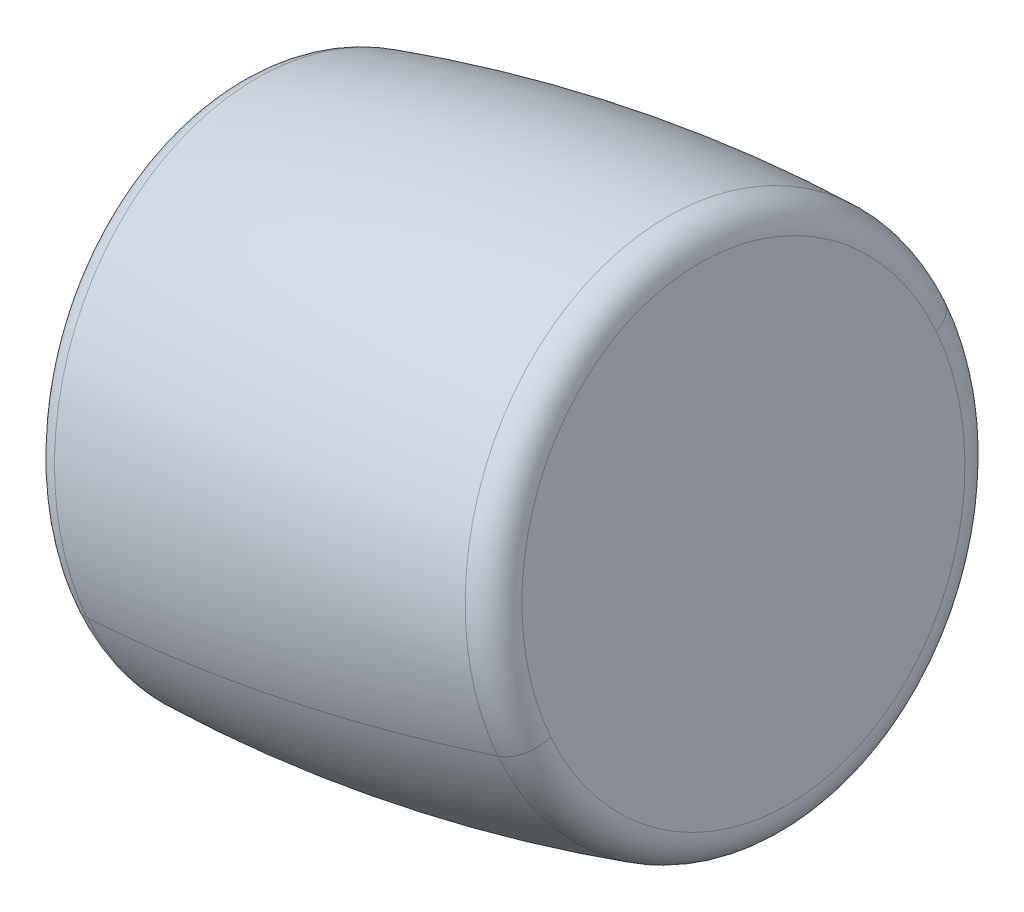
ISO-10303-21;
HEADER;
FILE_DESCRIPTION(('STEP AP214'),'2;1');
FILE_NAME('part.step','',(''),(''),'','','');
FILE_SCHEMA(('AUTOMOTIVE_DESIGN { 1 0 10303 214 1 1 1 1 }'));
ENDSEC;
DATA;
#1=APPLICATION_CONTEXT('core data for automotive mechanical design processes');
#2=APPLICATION_PROTOCOL_DEFINITION('international standard','automotive_design',2000,#1);
#3=PRODUCT_CONTEXT('',#1,'mechanical');
#4=PRODUCT('Part','Part','',(#3));
#5=PRODUCT_RELATED_PRODUCT_CATEGORY('part','',(#4));
#6=PRODUCT_DEFINITION_FORMATION('','',#4);
#7=PRODUCT_DEFINITION_CONTEXT('part definition',#1,'design');
#8=PRODUCT_DEFINITION('design','',#6,#7);
#9=PRODUCT_DEFINITION_SHAPE('','',#8);
#10=(LENGTH_UNIT() NAMED_UNIT(*) SI_UNIT(.MILLI.,.METRE.));
#11=(NAMED_UNIT(*) PLANE_ANGLE_UNIT() SI_UNIT($,.RADIAN.));
#12=(NAMED_UNIT(*) SI_UNIT($,.STERADIAN.) SOLID_ANGLE_UNIT());
#13=UNCERTAINTY_MEASURE_WITH_UNIT(LENGTH_MEASURE(1.E-05),#10,'distance_accuracy_value','');
#14=(GEOMETRIC_REPRESENTATION_CONTEXT(3) GLOBAL_UNCERTAINTY_ASSIGNED_CONTEXT((#13)) GLOBAL_UNIT_ASSIGNED_CONTEXT((#10,
#11,#12)) REPRESENTATION_CONTEXT('',''));
#15=CARTESIAN_POINT('',(0.,0.,0.));
#16=DIRECTION('',(0.,0.,1.));
#17=DIRECTION('',(1.,0.,0.));
#18=AXIS2_PLACEMENT_3D('',#15,#16,#17);
#19=CARTESIAN_POINT('',(1.54010446831639,26.713840470097,0.));
#20=DIRECTION('',(0.979045472484573,0.203641751140231,0.));
#21=DIRECTION('',(-0.203641751140231,0.979045472484573,0.));
#22=AXIS2_PLACEMENT_3D('',#19,#20,#21);
#23=PLANE('',#22);
#24=CARTESIAN_POINT('',(1.78853667863484,25.519456561249,3.75461180980708));
#25=CARTESIAN_POINT('',(1.80104744577193,25.4593087288212,3.73465175134516));
#26=CARTESIAN_POINT('',(1.81345825175028,25.3996414781963,3.71318133474125));
#27=CARTESIAN_POINT('',(1.83805047849984,25.2814097888562,3.66727713971395));
#28=CARTESIAN_POINT('',(1.85023189927106,25.2228453501411,3.64284336129057));
#29=CARTESIAN_POINT('',(1.87433589271673,25.1069609329248,3.59106979708889));
#30=CARTESIAN_POINT('',(1.88625846539118,25.0496409544237,3.56373001131059));
#31=CARTESIAN_POINT('',(1.90981607141257,24.9363833960465,3.50621070057865));
#32=CARTESIAN_POINT('',(1.9214511047595,24.8804458161703,3.47603117562501));
#33=CARTESIAN_POINT('',(1.94440559392697,24.7700878538822,3.41290498334538));
#34=CARTESIAN_POINT('',(1.95572504974751,24.7156674714703,3.3799583160194));
#35=CARTESIAN_POINT('',(1.97802111654827,24.6084749967775,3.31137723942565));
#36=CARTESIAN_POINT('',(1.98899772752849,24.5557029044967,3.27574283015788));
#37=CARTESIAN_POINT('',(2.01058166042933,24.4519341455528,3.20187210831697));
#38=CARTESIAN_POINT('',(2.02118898234995,24.4009374788898,3.16363579574382));
#39=CARTESIAN_POINT('',(2.04200878332531,24.3008424258428,3.084653384002));
#40=CARTESIAN_POINT('',(2.05222126238004,24.2517440394589,3.04390728483333));
#41=CARTESIAN_POINT('',(2.07222677482385,24.1555638294913,2.96000346026396));
#42=CARTESIAN_POINT('',(2.08201980821292,24.1084820059076,2.91684573486326));
#43=CARTESIAN_POINT('',(2.10116283706178,24.0164483457216,2.82822262872009));
#44=CARTESIAN_POINT('',(2.11051283252157,23.9714965091193,2.78275724797762));
#45=CARTESIAN_POINT('',(2.12874726055074,23.8838311158228,2.68962836119535));
#46=CARTESIAN_POINT('',(2.13763169312012,23.8411175591285,2.64196485515554));
#47=CARTESIAN_POINT('',(2.15491359199305,23.7580316263434,2.54455454335019));
#48=CARTESIAN_POINT('',(2.1633110582966,23.7176592502525,2.49480773758466));
#49=CARTESIAN_POINT('',(2.17959879440581,23.6393529392655,2.39335067073738));
#50=CARTESIAN_POINT('',(2.18748906421146,23.6014190043693,2.34164040965564));
#51=CARTESIAN_POINT('',(2.20274339897384,23.528080961943,2.23638100672495));
#52=CARTESIAN_POINT('',(2.21010746393058,23.4926768544129,2.18283186487601));
#53=CARTESIAN_POINT('',(2.22429164831764,23.4244837583151,2.07402370498377));
#54=CARTESIAN_POINT('',(2.23111176774795,23.3916947697474,2.01876468694047));
#55=CARTESIAN_POINT('',(2.24419163081708,23.3288109031196,1.90666989847417));
#56=CARTESIAN_POINT('',(2.2504513744559,23.2987160250596,1.84983412805117));
#57=CARTESIAN_POINT('',(2.26239540567131,23.2412928806445,1.73472275717462));
#58=CARTESIAN_POINT('',(2.26807969324791,23.2139646142894,1.67644715672107));
#59=CARTESIAN_POINT('',(2.27885911839224,23.1621405294716,1.55859651680926));
#60=CARTESIAN_POINT('',(2.28395425595997,23.1376447110089,1.499021477351));
#61=CARTESIAN_POINT('',(2.29354310645387,23.0915445345479,1.37871548091797));
#62=CARTESIAN_POINT('',(2.29803681938004,23.0699401765497,1.31798452394321));
#63=CARTESIAN_POINT('',(2.30641199484279,23.0296749678086,1.19551299867194));
#64=CARTESIAN_POINT('',(2.31029345737937,23.0110141170656,1.13377243037544));
#65=CARTESIAN_POINT('',(2.31743478127971,22.976680878459,1.00943042089754));
#66=CARTESIAN_POINT('',(2.32069464264346,22.9610084905953,0.946828979716151));
#67=CARTESIAN_POINT('',(2.3265849109066,22.9326899339022,0.820916036823533));
#68=CARTESIAN_POINT('',(2.32921531780597,22.9200437650729,0.757604535112306));
#69=CARTESIAN_POINT('',(2.33384034025973,22.8978081121768,0.630423994113066));
#70=CARTESIAN_POINT('',(2.33583495581412,22.8882186281102,0.566554954825055));
#71=CARTESIAN_POINT('',(2.33918359037431,22.8721194466466,0.43841320478216));
#72=CARTESIAN_POINT('',(2.34053760938012,22.8656097492497,0.374140494027277));
#73=CARTESIAN_POINT('',(2.34260178889279,22.8556858235569,0.245346239640472));
#74=CARTESIAN_POINT('',(2.34331194939964,22.852271595261,0.18082469600855));
#75=CARTESIAN_POINT('',(2.34408670107553,22.8485468329452,0.0516882139176979));
#76=CARTESIAN_POINT('',(2.34415129224456,22.8482362989252,-0.0129267245412326));
#77=CARTESIAN_POINT('',(2.34363474963903,22.850719673265,-0.142094333239756));
#78=CARTESIAN_POINT('',(2.34305361586446,22.8535135816248,-0.206647003479349));
#79=CARTESIAN_POINT('',(2.34124702337388,22.8621991099539,-0.335534562702444));
#80=CARTESIAN_POINT('',(2.34002156465787,22.8680907299233,-0.399869451685945));
#81=CARTESIAN_POINT('',(2.3369292745218,22.8829574880433,-0.528166460014223));
#82=CARTESIAN_POINT('',(2.33506244310174,22.8919326261939,-0.592128579359001));
#83=CARTESIAN_POINT('',(2.33069190491796,22.9129447987822,-0.719525958061912));
#84=CARTESIAN_POINT('',(2.32818819815425,22.9249818332199,-0.782961217420044));
#85=CARTESIAN_POINT('',(2.32254994093207,22.9520888001124,-0.909152055053596));
#86=CARTESIAN_POINT('',(2.3194153904736,22.9671587325671,-0.971907633329017));
#87=CARTESIAN_POINT('',(2.31252299726851,23.0002951907061,-1.09658792511234));
#88=CARTESIAN_POINT('',(2.3087651545219,23.0183617163905,-1.15851263862025));
#89=CARTESIAN_POINT('',(2.30063522971284,23.0574478371461,-1.28138201880974));
#90=CARTESIAN_POINT('',(2.2962631476504,23.0784674322173,-1.34232668549132));
#91=CARTESIAN_POINT('',(2.28691527693834,23.123409053701,-1.46308915098801));
#92=CARTESIAN_POINT('',(2.28193948828872,23.1473310801134,-1.52290694980311));
#93=CARTESIAN_POINT('',(2.27139619151297,23.1980199340226,-1.64127157325007));
#94=CARTESIAN_POINT('',(2.26582868338684,23.2247867615194,-1.69981839788193));
#95=CARTESIAN_POINT('',(2.25411536027282,23.2811007339652,-1.81550002853377));
#96=CARTESIAN_POINT('',(2.24796954528493,23.3106478789143,-1.87263483455375));
#97=CARTESIAN_POINT('',(2.23511441425399,23.3724513046046,-1.9853547852297));
#98=CARTESIAN_POINT('',(2.22840509821094,23.4047075853458,-2.04093992988568));
#99=CARTESIAN_POINT('',(2.21443912839971,23.4718515744147,-2.15042664835148));
#100=CARTESIAN_POINT('',(2.20718247463152,23.5067392827425,-2.2043282221613));
#101=CARTESIAN_POINT('',(2.19213931128455,23.5790620794393,-2.31031794532225));
#102=CARTESIAN_POINT('',(2.18435280170576,23.6164971678084,-2.36240609467338));
#103=CARTESIAN_POINT('',(2.16826868512117,23.6938245401811,-2.46464348400279));
#104=CARTESIAN_POINT('',(2.15997107811537,23.7337168241848,-2.51479272398106));
#105=CARTESIAN_POINT('',(2.14288475633882,23.8158624838203,-2.61303148065309));
#106=CARTESIAN_POINT('',(2.13409604156807,23.8581158594522,-2.66112099734684));
#107=CARTESIAN_POINT('',(2.11604867704531,23.9448819102613,-2.75512445559197));
#108=CARTESIAN_POINT('',(2.1067900272933,23.9893945854385,-2.80103839714334));
#109=CARTESIAN_POINT('',(2.08782509770622,24.080572000405,-2.89058009439693));
#110=CARTESIAN_POINT('',(2.07811881787115,24.1272367401943,-2.93420785009914));
#111=CARTESIAN_POINT('',(2.05828201139626,24.2226058649393,-3.01907207256957));
#112=CARTESIAN_POINT('',(2.04815148475644,24.2713102498951,-3.06030853933779));
#113=CARTESIAN_POINT('',(2.02749058999804,24.3706413318438,-3.14029084167991));
#114=CARTESIAN_POINT('',(2.01696022187946,24.4212680288368,-3.17903667725381));
#115=CARTESIAN_POINT('',(1.9955250127427,24.5243217707124,-3.25394437509565));
#116=CARTESIAN_POINT('',(1.98462017172451,24.5767488155951,-3.2901062373636));
#117=CARTESIAN_POINT('',(1.96246228750571,24.683276951907,-3.35975887149992));
#118=CARTESIAN_POINT('',(1.95120924430508,24.7373780433362,-3.3932496433683));
#119=CARTESIAN_POINT('',(1.92838206528811,24.8471239384733,-3.45747941450263));
#120=CARTESIAN_POINT('',(1.91680792947177,24.9027687421811,-3.48821841376857));
#121=CARTESIAN_POINT('',(1.89336644833032,25.0154680086693,-3.54687058675636));
#122=CARTESIAN_POINT('',(1.88149910300521,25.0725224714496,-3.57478376047822));
#123=CARTESIAN_POINT('',(1.85749979232057,25.1879036068847,-3.62771703709744));
#124=CARTESIAN_POINT('',(1.84536782696104,25.2462302795394,-3.65273713999481));
#125=CARTESIAN_POINT('',(1.82086850317475,25.3640153206599,-3.69982399934564));
#126=CARTESIAN_POINT('',(1.80850114474799,25.4234736891257,-3.7218907557991));
#127=CARTESIAN_POINT('',(1.78356082887693,25.5433788814508,-3.76301776151319));
#128=CARTESIAN_POINT('',(1.77098787143263,25.6038257053102,-3.78207801077383));
#129=CARTESIAN_POINT('',(1.74566664688227,25.725562186729,-3.81714608429153));
#130=CARTESIAN_POINT('',(1.73291837977622,25.7868518442886,-3.83315390854861));
#131=CARTESIAN_POINT('',(1.70727724759427,25.9101263409551,-3.8620785678114));
#132=CARTESIAN_POINT('',(1.69438438251838,25.9721111800622,-3.87499540281712));
#133=CARTESIAN_POINT('',(1.66848511443861,26.0966267129143,-3.89770696577921));
#134=CARTESIAN_POINT('',(1.65547871143474,26.1591574066593,-3.90750169373559));
#135=CARTESIAN_POINT('',(1.62938370106079,26.2846140068801,-3.92394544628281));
#136=CARTESIAN_POINT('',(1.61629509369071,26.3475399133558,-3.93059447087366));
#137=CARTESIAN_POINT('',(1.59006720619447,26.4736353449766,-3.94073079845274));
#138=CARTESIAN_POINT('',(1.57692792606831,26.5368048701216,-3.94421810144098));
#139=CARTESIAN_POINT('',(1.55063034670472,26.663235358315,-3.94802258517295));
#140=CARTESIAN_POINT('',(1.5374720474673,26.7264963213634,-3.94833976591668));
#141=CARTESIAN_POINT('',(1.51116812949551,26.8529572835909,-3.94580323889208));
#142=CARTESIAN_POINT('',(1.49802251076114,26.91615728277,-3.94294953112374));
#143=CARTESIAN_POINT('',(1.47177562229858,27.042344065059,-3.93407810993601));
#144=CARTESIAN_POINT('',(1.45867435257038,27.1053308481689,-3.92806039651661));
#145=CARTESIAN_POINT('',(1.43254772588292,27.2309394496783,-3.91287543126068));
#146=CARTESIAN_POINT('',(1.41952236892366,27.2935612680778,-3.90370817942416));
#147=CARTESIAN_POINT('',(1.39357894081786,27.418289108442,-3.88224633387669));
#148=CARTESIAN_POINT('',(1.38066086967131,27.4803951304068,-3.86995174016575));
#149=CARTESIAN_POINT('',(1.35496315702747,27.6039416481336,-3.84226441226705));
#150=CARTESIAN_POINT('',(1.34218351553016,27.6653821438957,-3.82687167807929));
#151=CARTESIAN_POINT('',(1.31679336335599,27.7874500076448,-3.79302670926388));
#152=CARTESIAN_POINT('',(1.30418285267913,27.8480773756318,-3.77457447463623));
#153=CARTESIAN_POINT('',(1.2916722579981,27.9082243789451,-3.75461180980708));
#154=B_SPLINE_CURVE_WITH_KNOTS('',3,(#24,#25,#26,#27,#28,#29,#30,#31,#32,#33,#34,#35,#36,#37,
#38,#39,#40,#41,#42,#43,#44,#45,#46,#47,#48,#49,#50,#51,#52,#53,#54,#55,#56,#57,#58,#59,#60,#61,
#62,#63,#64,#65,#66,#67,#68,#69,#70,#71,#72,#73,#74,#75,#76,#77,#78,#79,#80,#81,#82,#83,#84,#85,
#86,#87,#88,#89,#90,#91,#92,#93,#94,#95,#96,#97,#98,#99,#100,#101,#102,#103,#104,#105,#106,#107,
#108,#109,#110,#111,#112,#113,#114,#115,#116,#117,#118,#119,#120,#121,#122,#123,#124,#125,#126,
#127,#128,#129,#130,#131,#132,#133,#134,#135,#136,#137,#138,#139,#140,#141,#142,#143,#144,#145,
#146,#147,#148,#149,#150,#151,#152,#153),.UNSPECIFIED.,.F.,.F.,(4,2,2,2,2,2,2,2,2,2,2,2,2,2,2,2,
2,2,2,2,2,2,2,2,2,2,2,2,2,2,2,2,2,2,2,2,2,2,2,2,2,2,2,2,2,2,2,2,2,2,2,2,2,2,2,2,2,2,2,2,2,2,2,2,
4),(0.,0.193769318353957,0.387538636707915,0.581307955061874,0.775077273415829,
0.968846591769789,1.16261591012375,1.3563852284777,1.55015454683166,1.74392386518562,
1.93769318353958,2.13146250189353,2.32523182024749,2.51900113860145,2.71277045695541,
2.90653977530936,3.10030909366332,3.29407841201728,3.48784773037124,3.6816170487252,
3.87538636707915,4.06915568543311,4.26292500378707,4.45669432214103,4.65046364049498,
4.84423295884894,5.0380022772029,5.23177159555686,5.42554091391081,5.61931023226477,
5.81307955061873,6.00684886897268,6.20061818732664,6.3943875056806,6.58815682403456,
6.78192614238851,6.97569546074247,7.16946477909643,7.36323409745039,7.55700341580435,
7.7507727341583,7.94454205251226,8.13831137086622,8.33208068922018,8.52585000757413,
8.71961932592809,8.91338864428205,9.10715796263601,9.30092728098997,9.49469659934392,
9.68846591769788,9.88223523605184,10.0760045544058,10.2697738727598,10.4635431911137,
10.6573125094677,10.8510818278216,11.0448511461756,11.2386204645295,11.4323897828835,
11.6261591012375,11.8199284195914,12.0136977379454,12.2074670562993,12.4012363746533),.UNSPECIFIED.);
#155=CARTESIAN_POINT('',(1.78853667863483,25.519456561249,3.75461180980708));
#156=VERTEX_POINT('',#155);
#157=CARTESIAN_POINT('',(1.2916722579981,27.9082243789451,-3.75461180980708));
#158=VERTEX_POINT('',#157);
#159=EDGE_CURVE('E11',#156,#158,#154,.T.);
#160=ORIENTED_EDGE('',*,*,#159,.F.);
#161=CARTESIAN_POINT('',(1.2916722579981,27.9082243789451,-3.75461180980708));
#162=CARTESIAN_POINT('',(1.279161490861,27.9683722113729,-3.73465175134517));
#163=CARTESIAN_POINT('',(1.26675068488266,28.0280394619978,-3.71318133474125));
#164=CARTESIAN_POINT('',(1.24215845813309,28.1462711513379,-3.66727713971395));
#165=CARTESIAN_POINT('',(1.22997703736187,28.204835590053,-3.64284336129057));
#166=CARTESIAN_POINT('',(1.2058730439162,28.3207200072692,-3.59106979708889));
#167=CARTESIAN_POINT('',(1.19395047124175,28.3780399857703,-3.56373001131059));
#168=CARTESIAN_POINT('',(1.17039286522037,28.4912975441476,-3.50621070057865));
#169=CARTESIAN_POINT('',(1.15875783187344,28.5472351240237,-3.47603117562501));
#170=CARTESIAN_POINT('',(1.13580334270596,28.6575930863118,-3.41290498334538));
#171=CARTESIAN_POINT('',(1.12448388688542,28.7120134687238,-3.3799583160194));
#172=CARTESIAN_POINT('',(1.10218782008466,28.8192059434166,-3.31137723942565));
#173=CARTESIAN_POINT('',(1.09121120910444,28.8719780356974,-3.27574283015789));
#174=CARTESIAN_POINT('',(1.0696272762036,28.9757467946413,-3.20187210831697));
#175=CARTESIAN_POINT('',(1.05901995428298,29.0267434613043,-3.16363579574382));
#176=CARTESIAN_POINT('',(1.03820015330762,29.1268385143512,-3.084653384002));
#177=CARTESIAN_POINT('',(1.02798767425289,29.1759369007352,-3.04390728483333));
#178=CARTESIAN_POINT('',(1.00798216180908,29.2721171107028,-2.96000346026396));
#179=CARTESIAN_POINT('',(0.998189128420011,29.3191989342865,-2.91684573486326));
#180=CARTESIAN_POINT('',(0.979046099571149,29.4112325944725,-2.82822262872009));
#181=CARTESIAN_POINT('',(0.96969610411136,29.4561844310748,-2.78275724797762));
#182=CARTESIAN_POINT('',(0.951461676082193,29.5438498243713,-2.68962836119535));
#183=CARTESIAN_POINT('',(0.942577243512815,29.5865633810655,-2.64196485515554));
#184=CARTESIAN_POINT('',(0.925295344639884,29.6696493138506,-2.54455454335019));
#185=CARTESIAN_POINT('',(0.916897878336331,29.7100216899415,-2.49480773758466));
#186=CARTESIAN_POINT('',(0.900610142227127,29.7883280009286,-2.39335067073738));
#187=CARTESIAN_POINT('',(0.892719872421477,29.8262619358248,-2.34164040965564));
#188=CARTESIAN_POINT('',(0.877465537659088,29.8995999782511,-2.23638100672496));
#189=CARTESIAN_POINT('',(0.870101472702349,29.9350040857811,-2.18283186487601));
#190=CARTESIAN_POINT('',(0.855917288315296,30.0031971818789,-2.07402370498377));
#191=CARTESIAN_POINT('',(0.849097168884982,30.0359861704467,-2.01876468694047));
#192=CARTESIAN_POINT('',(0.836017305815853,30.0988700370744,-1.90666989847418));
#193=CARTESIAN_POINT('',(0.829757562177038,30.1289649151345,-1.84983412805117));
#194=CARTESIAN_POINT('',(0.817813530961623,30.1863880595496,-1.73472275717462));
#195=CARTESIAN_POINT('',(0.812129243385023,30.2137163259046,-1.67644715672107));
#196=CARTESIAN_POINT('',(0.801349818240695,30.2655404107224,-1.55859651680926));
#197=CARTESIAN_POINT('',(0.796254680672968,30.2900362291852,-1.499021477351));
#198=CARTESIAN_POINT('',(0.786665830179066,30.3361364056462,-1.37871548091798));
#199=CARTESIAN_POINT('',(0.782172117252892,30.3577407636444,-1.31798452394321));
#200=CARTESIAN_POINT('',(0.773796941790139,30.3980059723855,-1.19551299867195));
#201=CARTESIAN_POINT('',(0.769915479253561,30.4166668231284,-1.13377243037544));
#202=CARTESIAN_POINT('',(0.762774155353227,30.4510000617351,-1.00943042089754));
#203=CARTESIAN_POINT('',(0.759514293989472,30.4666724495987,-0.946828979716154));
#204=CARTESIAN_POINT('',(0.753624025726338,30.4949910062918,-0.820916036823537));
#205=CARTESIAN_POINT('',(0.750993618826959,30.5076371751212,-0.757604535112309));
#206=CARTESIAN_POINT('',(0.746368596373198,30.5298728280172,-0.63042399411307));
#207=CARTESIAN_POINT('',(0.744373980818815,30.5394623120839,-0.566554954825058));
#208=CARTESIAN_POINT('',(0.741025346258622,30.5555614935474,-0.438413204782164));
#209=CARTESIAN_POINT('',(0.739671327252811,30.5620711909443,-0.374140494027281));
#210=CARTESIAN_POINT('',(0.737607147740147,30.5719951166371,-0.245346239640476));
#211=CARTESIAN_POINT('',(0.736896987233293,30.5754093449331,-0.180824696008554));
#212=CARTESIAN_POINT('',(0.736122235557404,30.5791341072489,-0.0516882139177011));
#213=CARTESIAN_POINT('',(0.73605764438837,30.5794446412688,0.0129267245412299));
#214=CARTESIAN_POINT('',(0.736574186993905,30.576961266929,0.142094333239753));
#215=CARTESIAN_POINT('',(0.737155320768474,30.5741673585693,0.206647003479346));
#216=CARTESIAN_POINT('',(0.738961913259052,30.5654818302401,0.33553456270244));
#217=CARTESIAN_POINT('',(0.74018737197506,30.5595902102707,0.399869451685941));
#218=CARTESIAN_POINT('',(0.743279662111132,30.5447234521508,0.528166460014219));
#219=CARTESIAN_POINT('',(0.745146493531196,30.5357483140002,0.592128579358995));
#220=CARTESIAN_POINT('',(0.749517031714971,30.5147361414119,0.719525958061905));
#221=CARTESIAN_POINT('',(0.752020738478684,30.5026991069741,0.782961217420039));
#222=CARTESIAN_POINT('',(0.757658995700865,30.4755921400817,0.909152055053593));
#223=CARTESIAN_POINT('',(0.760793546159333,30.460522207627,0.971907633329014));
#224=CARTESIAN_POINT('',(0.767685939364418,30.4273857494879,1.09658792511234));
#225=CARTESIAN_POINT('',(0.771443782111034,30.4093192238036,1.15851263862024));
#226=CARTESIAN_POINT('',(0.779573706920089,30.370233103048,1.28138201880973));
#227=CARTESIAN_POINT('',(0.783945788982528,30.3492135079767,1.34232668549131));
#228=CARTESIAN_POINT('',(0.793293659694592,30.3042718864931,1.463089150988));
#229=CARTESIAN_POINT('',(0.798269448344216,30.2803498600806,1.52290694980311));
#230=CARTESIAN_POINT('',(0.808812745119965,30.2296610061714,1.64127157325007));
#231=CARTESIAN_POINT('',(0.814380253246091,30.2028941786747,1.69981839788193));
#232=CARTESIAN_POINT('',(0.826093576360109,30.1465802062289,1.81550002853377));
#233=CARTESIAN_POINT('',(0.832239391348003,30.1170330612798,1.87263483455374));
#234=CARTESIAN_POINT('',(0.845094522378944,30.0552296355895,1.9853547852297));
#235=CARTESIAN_POINT('',(0.851803838421991,30.0229733548483,2.04093992988568));
#236=CARTESIAN_POINT('',(0.865769808233224,29.9558293657793,2.15042664835148));
#237=CARTESIAN_POINT('',(0.873026462001409,29.9209416574516,2.2043282221613));
#238=CARTESIAN_POINT('',(0.888069625348384,29.8486188607547,2.31031794532225));
#239=CARTESIAN_POINT('',(0.895856134927174,29.8111837723856,2.36240609467338));
#240=CARTESIAN_POINT('',(0.911940251511762,29.7338564000129,2.46464348400278));
#241=CARTESIAN_POINT('',(0.920237858517562,29.6939641160093,2.51479272398106));
#242=CARTESIAN_POINT('',(0.93732418029411,29.6118184563738,2.61303148065308));
#243=CARTESIAN_POINT('',(0.946112895064858,29.5695650807419,2.66112099734684));
#244=CARTESIAN_POINT('',(0.96416025958762,29.4827990299328,2.75512445559196));
#245=CARTESIAN_POINT('',(0.973418909339634,29.4382863547556,2.80103839714334));
#246=CARTESIAN_POINT('',(0.992383838926714,29.347108939789,2.89058009439692));
#247=CARTESIAN_POINT('',(1.00209011876178,29.3004441999998,2.93420785009913));
#248=CARTESIAN_POINT('',(1.02192692523667,29.2050750752547,3.01907207256957));
#249=CARTESIAN_POINT('',(1.03205745187649,29.1563706902989,3.06030853933779));
#250=CARTESIAN_POINT('',(1.05271834663489,29.0570396083502,3.14029084167991));
#251=CARTESIAN_POINT('',(1.06324871475347,29.0064129113573,3.1790366772538));
#252=CARTESIAN_POINT('',(1.08468392389023,28.9033591694816,3.25394437509565));
#253=CARTESIAN_POINT('',(1.09558876490842,28.850932124599,3.29010623736359));
#254=CARTESIAN_POINT('',(1.11774664912722,28.7444039882871,3.35975887149992));
#255=CARTESIAN_POINT('',(1.12899969232785,28.6903028968578,3.3932496433683));
#256=CARTESIAN_POINT('',(1.15182687134482,28.5805570017208,3.45747941450262));
#257=CARTESIAN_POINT('',(1.16340100716116,28.524912198013,3.48821841376857));
#258=CARTESIAN_POINT('',(1.18684248830262,28.4122129315248,3.54687058675636));
#259=CARTESIAN_POINT('',(1.19870983362772,28.3551584687444,3.57478376047821));
#260=CARTESIAN_POINT('',(1.22270914431236,28.2397773333094,3.62771703709744));
#261=CARTESIAN_POINT('',(1.23484110967189,28.1814506606547,3.65273713999481));
#262=CARTESIAN_POINT('',(1.25934043345818,28.0636656195342,3.69982399934564));
#263=CARTESIAN_POINT('',(1.27170779188494,28.0042072510684,3.7218907557991));
#264=CARTESIAN_POINT('',(1.296648107756,27.8843020587432,3.76301776151319));
#265=CARTESIAN_POINT('',(1.3092210652003,27.8238552348839,3.78207801077382));
#266=CARTESIAN_POINT('',(1.33454228975066,27.702118753465,3.81714608429153));
#267=CARTESIAN_POINT('',(1.34729055685671,27.6408290959055,3.8331539085486));
#268=CARTESIAN_POINT('',(1.37293168903866,27.5175545992389,3.8620785678114));
#269=CARTESIAN_POINT('',(1.38582455411455,27.4555697601319,3.87499540281712));
#270=CARTESIAN_POINT('',(1.41172382219432,27.3310542272798,3.89770696577921));
#271=CARTESIAN_POINT('',(1.42473022519819,27.2685235335347,3.90750169373559));
#272=CARTESIAN_POINT('',(1.45082523557214,27.143066933314,3.92394544628281));
#273=CARTESIAN_POINT('',(1.46391384294222,27.0801410268382,3.93059447087365));
#274=CARTESIAN_POINT('',(1.49014173043846,26.9540455952175,3.94073079845274));
#275=CARTESIAN_POINT('',(1.50328101056462,26.8908760700725,3.94421810144098));
#276=CARTESIAN_POINT('',(1.52957858992821,26.7644455818791,3.94802258517295));
#277=CARTESIAN_POINT('',(1.54273688916563,26.7011846188307,3.94833976591668));
#278=CARTESIAN_POINT('',(1.56904080713742,26.5747236566032,3.94580323889208));
#279=CARTESIAN_POINT('',(1.58218642587179,26.5115236574241,3.94294953112374));
#280=CARTESIAN_POINT('',(1.60843331433435,26.3853368751351,3.93407810993601));
#281=CARTESIAN_POINT('',(1.62153458406255,26.3223500920252,3.92806039651661));
#282=CARTESIAN_POINT('',(1.64766121075002,26.1967414905158,3.91287543126068));
#283=CARTESIAN_POINT('',(1.66068656770927,26.1341196721163,3.90370817942416));
#284=CARTESIAN_POINT('',(1.68662999581508,26.009391831752,3.88224633387669));
#285=CARTESIAN_POINT('',(1.69954806696162,25.9472858097873,3.86995174016575));
#286=CARTESIAN_POINT('',(1.72524577960547,25.8237392920604,3.84226441226705));
#287=CARTESIAN_POINT('',(1.73802542110277,25.7622987962984,3.82687167807929));
#288=CARTESIAN_POINT('',(1.76341557327694,25.6402309325493,3.79302670926388));
#289=CARTESIAN_POINT('',(1.7760260839538,25.5796035645623,3.77457447463623));
#290=CARTESIAN_POINT('',(1.78853667863483,25.519456561249,3.75461180980709));
#291=B_SPLINE_CURVE_WITH_KNOTS('',3,(#161,#162,#163,#164,#165,#166,#167,#168,#169,#170,#171,
#172,#173,#174,#175,#176,#177,#178,#179,#180,#181,#182,#183,#184,#185,#186,#187,#188,#189,#190,
#191,#192,#193,#194,#195,#196,#197,#198,#199,#200,#201,#202,#203,#204,#205,#206,#207,#208,#209,
#210,#211,#212,#213,#214,#215,#216,#217,#218,#219,#220,#221,#222,#223,#224,#225,#226,#227,#228,
#229,#230,#231,#232,#233,#234,#235,#236,#237,#238,#239,#240,#241,#242,#243,#244,#245,#246,#247,
#248,#249,#250,#251,#252,#253,#254,#255,#256,#257,#258,#259,#260,#261,#262,#263,#264,#265,#266,
#267,#268,#269,#270,#271,#272,#273,#274,#275,#276,#277,#278,#279,#280,#281,#282,#283,#284,#285,
#286,#287,#288,#289,#290),.UNSPECIFIED.,.F.,.F.,(4,2,2,2,2,2,2,2,2,2,2,2,2,2,2,2,2,2,2,2,2,2,2,
2,2,2,2,2,2,2,2,2,2,2,2,2,2,2,2,2,2,2,2,2,2,2,2,2,2,2,2,2,2,2,2,2,2,2,2,2,2,2,2,2,4),(0.,
0.193769318353957,0.387538636707915,0.581307955061871,0.775077273415829,0.968846591769789,
1.16261591012375,1.3563852284777,1.55015454683166,1.74392386518562,1.93769318353958,
2.13146250189353,2.32523182024749,2.51900113860145,2.7127704569554,2.90653977530936,
3.10030909366332,3.29407841201728,3.48784773037124,3.68161704872519,3.87538636707915,
4.06915568543311,4.26292500378706,4.45669432214102,4.65046364049498,4.84423295884894,
5.03800227720289,5.23177159555685,5.42554091391081,5.61931023226476,5.81307955061872,
6.00684886897268,6.20061818732664,6.3943875056806,6.58815682403455,6.78192614238851,
6.97569546074247,7.16946477909643,7.36323409745038,7.55700341580434,7.7507727341583,
7.94454205251226,8.13831137086621,8.33208068922017,8.52585000757413,8.71961932592808,
8.91338864428204,9.107157962636,9.30092728098996,9.49469659934392,9.68846591769787,
9.88223523605183,10.0760045544058,10.2697738727597,10.4635431911137,10.6573125094677,
10.8510818278216,11.0448511461756,11.2386204645295,11.4323897828835,11.6261591012374,
11.8199284195914,12.0136977379454,12.2074670562993,12.4012363746533),.UNSPECIFIED.);
#292=EDGE_CURVE('E25',#158,#156,#291,.T.);
#293=ORIENTED_EDGE('',*,*,#292,.F.);
#294=EDGE_LOOP('',(#160,#293));
#295=FACE_BOUND('',#294,.T.);
#296=ADVANCED_FACE('F16',(#295),#23,.F.);
#297=CARTESIAN_POINT('',(2.07857947818464,26.8258434332245,0.));
#298=DIRECTION('',(0.979045472484573,0.203641751140231,0.));
#299=DIRECTION('',(0.193674814411672,-0.931127576355721,-0.309016994374947));
#300=AXIS2_PLACEMENT_3D('',#297,#298,#299);
#301=TOROIDAL_SURFACE('',#300,3.94783248469102,0.550000000001694);
#302=CARTESIAN_POINT('',(1.83014726786627,28.0202273420726,-3.75461180980708));
#303=DIRECTION('',(-0.193674814411672,0.93112757635572,0.30901699437495));
#304=DIRECTION('',(-0.178089458068445,0.2763802866984,-0.944403558892806));
#305=AXIS2_PLACEMENT_3D('',#302,#303,#304);
#306=CIRCLE('',#305,0.550000000001695);
#307=CARTESIAN_POINT('',(1.73219806592832,28.1722364997572,-4.27403376719973));
#308=VERTEX_POINT('',#307);
#309=EDGE_CURVE('E103',#308,#158,#306,.T.);
#310=ORIENTED_EDGE('',*,*,#309,.T.);
#311=ORIENTED_EDGE('',*,*,#292,.T.);
#312=CARTESIAN_POINT('',(2.32701168850301,25.6314595243764,3.75461180980708));
#313=DIRECTION('',(0.193674814411672,-0.931127576355721,-0.309016994374947));
#314=DIRECTION('',(-0.05311234967314,-0.324470331868413,0.944403558892807));
#315=AXIS2_PLACEMENT_3D('',#312,#313,#314);
#316=CIRCLE('',#315,0.550000000001695);
#317=CARTESIAN_POINT('',(2.29779989618269,25.4530008418483,4.27403376719973));
#318=VERTEX_POINT('',#317);
#319=EDGE_CURVE('E99',#318,#156,#316,.T.);
#320=ORIENTED_EDGE('',*,*,#319,.F.);
#321=CARTESIAN_POINT('',(2.01499898105551,26.8126186708027,0.));
#322=DIRECTION('',(0.979045472484573,0.203641751140231,0.));
#323=DIRECTION('',(-0.062928761866605,0.302541689263583,-0.951056516295154));
#324=AXIS2_PLACEMENT_3D('',#321,#322,#323);
#325=CIRCLE('',#324,4.49398505132928);
#326=EDGE_CURVE('E94',#308,#318,#325,.T.);
#327=ORIENTED_EDGE('',*,*,#326,.F.);
#328=EDGE_LOOP('',(#310,#311,#320,#327));
#329=FACE_BOUND('',#328,.T.);
#330=ADVANCED_FACE('F110',(#329),#301,.T.);
#331=CARTESIAN_POINT('',(5.74999999999632,27.5894999999993,0.));
#332=DIRECTION('',(0.979045472484573,0.203641751140231,0.));
#333=DIRECTION('',(0.193674814411672,-0.931127576355721,-0.309016994374947));
#334=AXIS2_PLACEMENT_3D('',#331,#332,#333);
#335=DEGENERATE_TOROIDAL_SURFACE('',#334,27.5895000000617,32.3095000000614,.F.);
#336=CARTESIAN_POINT('',(7.48617307551892,19.2425260640429,26.2391737563838));
#337=DIRECTION('',(-0.193674814411672,0.93112757635572,0.30901699437495));
#338=DIRECTION('',(0.0531121471048594,0.324470297440493,-0.944403582113489));
#339=AXIS2_PLACEMENT_3D('',#336,#337,#338);
#340=CIRCLE('',#339,32.3095000000615);
#341=CARTESIAN_POINT('',(9.20219999240664,29.7259991392164,-4.27403377997001));
#342=VERTEX_POINT('',#341);
#343=EDGE_CURVE('E89',#342,#308,#340,.T.);
#344=ORIENTED_EDGE('',*,*,#343,.T.);
#345=ORIENTED_EDGE('',*,*,#326,.T.);
#346=CARTESIAN_POINT('',(4.01382692447374,35.9364739359555,-26.2391737563838));
#347=DIRECTION('',(0.193674814411672,-0.931127576355721,-0.309016994374947));
#348=DIRECTION('',(0.17808925857306,-0.276380335899836,0.94440358211349));
#349=AXIS2_PLACEMENT_3D('',#346,#347,#348);
#350=CIRCLE('',#349,32.3095000000615);
#351=CARTESIAN_POINT('',(9.76780182435097,27.0067634731828,4.27403377997002));
#352=VERTEX_POINT('',#351);
#353=EDGE_CURVE('E78',#352,#318,#350,.T.);
#354=ORIENTED_EDGE('',*,*,#353,.F.);
#355=CARTESIAN_POINT('',(9.48500090837882,28.3663813061996,0.));
#356=DIRECTION('',(0.979045472484573,0.20364175114023,0.));
#357=DIRECTION('',(-0.0629287618666059,0.302541689263588,-0.951056516295152));
#358=AXIS2_PLACEMENT_3D('',#355,#356,#357);
#359=CIRCLE('',#358,4.49398506475677);
#360=EDGE_CURVE('E76',#342,#352,#359,.T.);
#361=ORIENTED_EDGE('',*,*,#360,.F.);
#362=EDGE_LOOP('',(#344,#345,#354,#361));
#363=FACE_BOUND('',#362,.T.);
#364=ADVANCED_FACE('F119',(#363),#335,.F.);
#365=CARTESIAN_POINT('',(9.4214205218182,28.3531565667761,0.));
#366=DIRECTION('',(0.979045472484573,0.203641751140231,0.));
#367=DIRECTION('',(0.193674814411746,-0.931127576356077,-0.309016994373826));
#368=AXIS2_PLACEMENT_3D('',#365,#366,#367);
#369=TOROIDAL_SURFACE('',#368,3.9478324846923,0.549999999999174);
#370=CARTESIAN_POINT('',(9.17298831150155,29.5475404756159,-3.75461180981118));
#371=DIRECTION('',(-0.193674814411819,0.931127576356434,0.309016994372705));
#372=DIRECTION('',(0.979045472484573,0.20364175114023,0.));
#373=AXIS2_PLACEMENT_3D('',#370,#371,#372);
#374=CIRCLE('',#373,0.549999999999174);
#375=CARTESIAN_POINT('',(9.71146332136726,29.6595434387429,-3.75461180981118));
#376=VERTEX_POINT('',#375);
#377=EDGE_CURVE('E60',#376,#342,#374,.T.);
#378=ORIENTED_EDGE('',*,*,#377,.T.);
#379=ORIENTED_EDGE('',*,*,#360,.T.);
#380=CARTESIAN_POINT('',(9.66985273213665,27.1587726579276,3.75461180980831));
#381=DIRECTION('',(0.193674814411672,-0.931127576355721,-0.309016994374947));
#382=DIRECTION('',(0.979045472484573,0.20364175114023,0.));
#383=AXIS2_PLACEMENT_3D('',#380,#381,#382);
#384=CIRCLE('',#383,0.549999999999174);
#385=CARTESIAN_POINT('',(10.2083277420024,27.2707756210546,3.75461180980831));
#386=VERTEX_POINT('',#385);
#387=EDGE_CURVE('E62',#386,#352,#384,.T.);
#388=ORIENTED_EDGE('',*,*,#387,.F.);
#389=CARTESIAN_POINT('',(9.71146332136719,29.6595434387426,-3.75461180981063));
#390=CARTESIAN_POINT('',(9.55133406783053,30.4293945120594,-3.49906589562847));
#391=CARTESIAN_POINT('',(9.40478143758655,31.1339734518774,-3.03790594602595));
#392=CARTESIAN_POINT('',(9.28662921086374,31.7020121865143,-2.39337832818185));
#393=CARTESIAN_POINT('',(9.1304297607435,32.4529700013462,-0.865784228785519));
#394=CARTESIAN_POINT('',(9.1465916920021,32.3752685205018,0.841744677898482));
#395=CARTESIAN_POINT('',(9.20116407082151,32.1129016919575,1.66650929977616));
#396=CARTESIAN_POINT('',(9.39247593668857,31.1931344288056,3.09457850220347));
#397=CARTESIAN_POINT('',(9.70169332142491,29.7065145247606,3.87957882720947));
#398=CARTESIAN_POINT('',(9.87442890140389,28.8760561999402,4.05998169037134));
#399=CARTESIAN_POINT('',(10.0481922173589,28.0406568438793,4.01006294734638));
#400=CARTESIAN_POINT('',(10.2083277420022,27.2707756210548,3.75461180980776));
#401=B_SPLINE_CURVE_WITH_KNOTS('',5,(#389,#390,#391,#392,#393,#394,#395,#396,#397,#398,#399,
#400),.UNSPECIFIED.,.F.,.F.,(6,3,3,6),(0.,1.04719755119738,2.09439510239476,3.14159265359215),.UNSPECIFIED.);
#402=EDGE_CURVE('E54',#376,#386,#401,.T.);
#403=ORIENTED_EDGE('',*,*,#402,.F.);
#404=EDGE_LOOP('',(#378,#379,#388,#403));
#405=FACE_BOUND('',#404,.T.);
#406=ADVANCED_FACE('F57',(#405),#369,.T.);
#407=CARTESIAN_POINT('',(9.15595201129289,32.330267050168,0.));
#408=DIRECTION('',(-0.979045472484573,-0.203641751140231,0.));
#409=DIRECTION('',(0.203641751140231,-0.979045472484573,0.));
#410=AXIS2_PLACEMENT_3D('',#407,#408,#409);
#411=PLANE('',#410);
#412=ORIENTED_EDGE('',*,*,#402,.T.);
#413=CARTESIAN_POINT('',(9.95989553168391,28.465159529903,0.));
#414=DIRECTION('',(0.979045472484573,0.203641751140231,0.));
#415=DIRECTION('',(-0.203641751140231,0.979045472484573,0.));
#416=AXIS2_PLACEMENT_3D('',#413,#414,#415);
#417=CIRCLE('',#416,3.94783248469172);
#418=EDGE_CURVE('E66',#386,#376,#417,.T.);
#419=ORIENTED_EDGE('',*,*,#418,.T.);
#420=EDGE_LOOP('',(#412,#419));
#421=FACE_BOUND('',#420,.T.);
#422=ADVANCED_FACE('F69',(#421),#411,.F.);
#423=CARTESIAN_POINT('',(9.4214205218182,28.3531565667761,0.));
#424=DIRECTION('',(0.979045472484573,0.20364175114023,0.));
#425=DIRECTION('',(-0.193674814411863,0.931127576356638,0.309016994372065));
#426=AXIS2_PLACEMENT_3D('',#423,#424,#425);
#427=TOROIDAL_SURFACE('',#426,3.9478324846923,0.549999999999174);
#428=ORIENTED_EDGE('',*,*,#377,.F.);
#429=ORIENTED_EDGE('',*,*,#418,.F.);
#430=ORIENTED_EDGE('',*,*,#387,.T.);
#431=CARTESIAN_POINT('',(9.48500090837882,28.3663813061996,0.));
#432=DIRECTION('',(0.979045472484573,0.203641751140231,0.));
#433=DIRECTION('',(-0.203641751140231,0.979045472484573,0.));
#434=AXIS2_PLACEMENT_3D('',#431,#432,#433);
#435=CIRCLE('',#434,4.49398506475677);
#436=EDGE_CURVE('E71',#352,#342,#435,.T.);
#437=ORIENTED_EDGE('',*,*,#436,.T.);
#438=EDGE_LOOP('',(#428,#429,#430,#437));
#439=FACE_BOUND('',#438,.T.);
#440=ADVANCED_FACE('F74',(#439),#427,.T.);
#441=CARTESIAN_POINT('',(5.74999999999632,27.5894999999993,0.));
#442=DIRECTION('',(0.979045472484573,0.20364175114023,0.));
#443=DIRECTION('',(-0.193674814411672,0.93112757635572,0.309016994374949));
#444=AXIS2_PLACEMENT_3D('',#441,#442,#443);
#445=DEGENERATE_TOROIDAL_SURFACE('',#444,27.5895000000617,32.3095000000614,.F.);
#446=ORIENTED_EDGE('',*,*,#343,.F.);
#447=ORIENTED_EDGE('',*,*,#436,.F.);
#448=ORIENTED_EDGE('',*,*,#353,.T.);
#449=CARTESIAN_POINT('',(2.01499898105551,26.8126186708027,0.));
#450=DIRECTION('',(0.979045472484573,0.203641751140231,0.));
#451=DIRECTION('',(-0.203641751140231,0.979045472484573,0.));
#452=AXIS2_PLACEMENT_3D('',#449,#450,#451);
#453=CIRCLE('',#452,4.49398505132928);
#454=EDGE_CURVE('E150',#318,#308,#453,.T.);
#455=ORIENTED_EDGE('',*,*,#454,.T.);
#456=EDGE_LOOP('',(#446,#447,#448,#455));
#457=FACE_BOUND('',#456,.T.);
#458=ADVANCED_FACE('F170',(#457),#445,.F.);
#459=CARTESIAN_POINT('',(2.07857947818464,26.8258434332245,0.));
#460=DIRECTION('',(0.979045472484573,0.20364175114023,0.));
#461=DIRECTION('',(-0.193674814411672,0.931127576355721,0.309016994374947));
#462=AXIS2_PLACEMENT_3D('',#459,#460,#461);
#463=TOROIDAL_SURFACE('',#462,3.94783248469102,0.550000000001694);
#464=ORIENTED_EDGE('',*,*,#309,.F.);
#465=ORIENTED_EDGE('',*,*,#454,.F.);
#466=ORIENTED_EDGE('',*,*,#319,.T.);
#467=ORIENTED_EDGE('',*,*,#159,.T.);
#468=EDGE_LOOP('',(#464,#465,#466,#467));
#469=FACE_BOUND('',#468,.T.);
#470=ADVANCED_FACE('F161',(#469),#463,.T.);
#471=CLOSED_SHELL('',(#296,#330,#364,#406,#422,#440,#458,#470));
#472=MANIFOLD_SOLID_BREP('B1',#471);
#473=ADVANCED_BREP_SHAPE_REPRESENTATION('',(#18,#472),#14);
#474=SHAPE_DEFINITION_REPRESENTATION(#9,#473);
ENDSEC;
END-ISO-10303-21;
